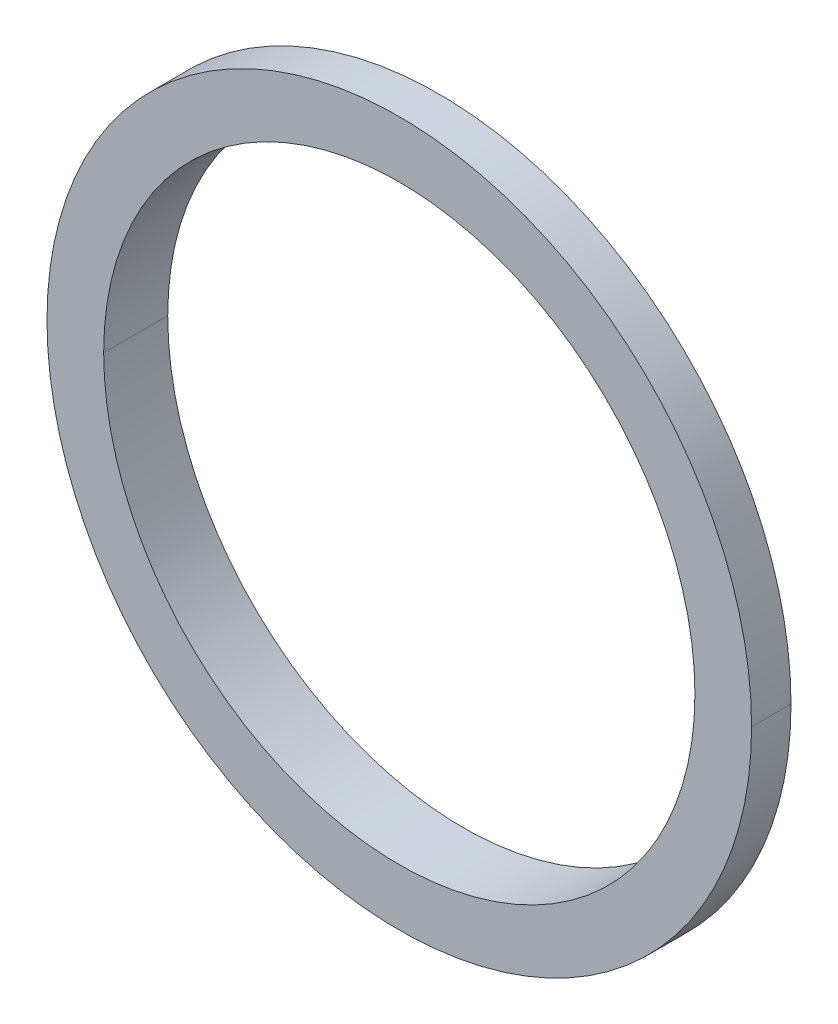
ISO-10303-21;
HEADER;
FILE_DESCRIPTION(('STEP AP214'),'2;1');
FILE_NAME('part.step','',(''),(''),'','','');
FILE_SCHEMA(('AUTOMOTIVE_DESIGN { 1 0 10303 214 1 1 1 1 }'));
ENDSEC;
DATA;
#1=APPLICATION_CONTEXT('core data for automotive mechanical design processes');
#2=APPLICATION_PROTOCOL_DEFINITION('international standard','automotive_design',2000,#1);
#3=PRODUCT_CONTEXT('',#1,'mechanical');
#4=PRODUCT('Part','Part','',(#3));
#5=PRODUCT_RELATED_PRODUCT_CATEGORY('part','',(#4));
#6=PRODUCT_DEFINITION_FORMATION('','',#4);
#7=PRODUCT_DEFINITION_CONTEXT('part definition',#1,'design');
#8=PRODUCT_DEFINITION('design','',#6,#7);
#9=PRODUCT_DEFINITION_SHAPE('','',#8);
#10=(LENGTH_UNIT() NAMED_UNIT(*) SI_UNIT(.MILLI.,.METRE.));
#11=(NAMED_UNIT(*) PLANE_ANGLE_UNIT() SI_UNIT($,.RADIAN.));
#12=(NAMED_UNIT(*) SI_UNIT($,.STERADIAN.) SOLID_ANGLE_UNIT());
#13=UNCERTAINTY_MEASURE_WITH_UNIT(LENGTH_MEASURE(1.E-05),#10,'distance_accuracy_value','');
#14=(GEOMETRIC_REPRESENTATION_CONTEXT(3) GLOBAL_UNCERTAINTY_ASSIGNED_CONTEXT((#13)) GLOBAL_UNIT_ASSIGNED_CONTEXT((#10,
#11,#12)) REPRESENTATION_CONTEXT('',''));
#15=CARTESIAN_POINT('',(0.,0.,0.));
#16=DIRECTION('',(0.,0.,1.));
#17=DIRECTION('',(1.,0.,0.));
#18=AXIS2_PLACEMENT_3D('',#15,#16,#17);
#19=CARTESIAN_POINT('',(0.,0.,0.));
#20=DIRECTION('',(0.,0.,1.));
#21=DIRECTION('',(1.,0.,0.));
#22=AXIS2_PLACEMENT_3D('',#19,#20,#21);
#23=PLANE('',#22);
#24=CARTESIAN_POINT('',(0.,0.,0.));
#25=DIRECTION('',(0.,0.,1.));
#26=DIRECTION('',(1.,0.,0.));
#27=AXIS2_PLACEMENT_3D('',#24,#25,#26);
#28=CIRCLE('',#27,12.);
#29=CARTESIAN_POINT('',(12.,0.,0.));
#30=VERTEX_POINT('',#29);
#31=CARTESIAN_POINT('',(-12.,0.,0.));
#32=VERTEX_POINT('',#31);
#33=EDGE_CURVE('E20',#30,#32,#28,.T.);
#34=ORIENTED_EDGE('',*,*,#33,.T.);
#35=CARTESIAN_POINT('',(0.,0.,0.));
#36=DIRECTION('',(0.,0.,1.));
#37=DIRECTION('',(1.,0.,0.));
#38=AXIS2_PLACEMENT_3D('',#35,#36,#37);
#39=CIRCLE('',#38,12.);
#40=EDGE_CURVE('E11',#32,#30,#39,.T.);
#41=ORIENTED_EDGE('',*,*,#40,.T.);
#42=EDGE_LOOP('',(#34,#41));
#43=FACE_BOUND('',#42,.T.);
#44=CARTESIAN_POINT('',(0.,0.,0.));
#45=DIRECTION('',(0.,0.,1.));
#46=DIRECTION('',(1.,0.,0.));
#47=AXIS2_PLACEMENT_3D('',#44,#45,#46);
#48=CIRCLE('',#47,12.5);
#49=CARTESIAN_POINT('',(-12.5,0.,0.));
#50=VERTEX_POINT('',#49);
#51=CARTESIAN_POINT('',(12.5,0.,0.));
#52=VERTEX_POINT('',#51);
#53=EDGE_CURVE('E69',#50,#52,#48,.T.);
#54=ORIENTED_EDGE('',*,*,#53,.F.);
#55=CARTESIAN_POINT('',(0.,0.,0.));
#56=DIRECTION('',(0.,0.,1.));
#57=DIRECTION('',(1.,0.,0.));
#58=AXIS2_PLACEMENT_3D('',#55,#56,#57);
#59=CIRCLE('',#58,12.5);
#60=EDGE_CURVE('E98',#52,#50,#59,.T.);
#61=ORIENTED_EDGE('',*,*,#60,.F.);
#62=EDGE_LOOP('',(#54,#61));
#63=FACE_BOUND('',#62,.T.);
#64=ADVANCED_FACE('F16',(#43,#63),#23,.F.);
#65=CARTESIAN_POINT('',(0.,0.,2.6));
#66=DIRECTION('',(0.,0.,1.));
#67=DIRECTION('',(1.,0.,0.));
#68=AXIS2_PLACEMENT_3D('',#65,#66,#67);
#69=PLANE('',#68);
#70=CARTESIAN_POINT('',(0.,0.,2.6));
#71=DIRECTION('',(0.,0.,1.));
#72=DIRECTION('',(1.,0.,0.));
#73=AXIS2_PLACEMENT_3D('',#70,#71,#72);
#74=CIRCLE('',#73,12.);
#75=CARTESIAN_POINT('',(-12.,0.,2.6));
#76=VERTEX_POINT('',#75);
#77=CARTESIAN_POINT('',(12.,0.,2.6));
#78=VERTEX_POINT('',#77);
#79=EDGE_CURVE('E27',#76,#78,#74,.T.);
#80=ORIENTED_EDGE('',*,*,#79,.F.);
#81=CARTESIAN_POINT('',(0.,0.,2.6));
#82=DIRECTION('',(0.,0.,1.));
#83=DIRECTION('',(1.,0.,0.));
#84=AXIS2_PLACEMENT_3D('',#81,#82,#83);
#85=CIRCLE('',#84,12.);
#86=EDGE_CURVE('E124',#78,#76,#85,.T.);
#87=ORIENTED_EDGE('',*,*,#86,.F.);
#88=EDGE_LOOP('',(#80,#87));
#89=FACE_BOUND('',#88,.T.);
#90=CARTESIAN_POINT('',(0.,0.,2.6));
#91=DIRECTION('',(0.,0.,1.));
#92=DIRECTION('',(1.,0.,0.));
#93=AXIS2_PLACEMENT_3D('',#90,#91,#92);
#94=CIRCLE('',#93,14.3);
#95=CARTESIAN_POINT('',(14.3,0.,2.6));
#96=VERTEX_POINT('',#95);
#97=CARTESIAN_POINT('',(-14.3,0.,2.6));
#98=VERTEX_POINT('',#97);
#99=EDGE_CURVE('E120',#96,#98,#94,.T.);
#100=ORIENTED_EDGE('',*,*,#99,.T.);
#101=CARTESIAN_POINT('',(0.,0.,2.6));
#102=DIRECTION('',(0.,0.,1.));
#103=DIRECTION('',(1.,0.,0.));
#104=AXIS2_PLACEMENT_3D('',#101,#102,#103);
#105=CIRCLE('',#104,14.3);
#106=EDGE_CURVE('E109',#98,#96,#105,.T.);
#107=ORIENTED_EDGE('',*,*,#106,.T.);
#108=EDGE_LOOP('',(#100,#107));
#109=FACE_BOUND('',#108,.T.);
#110=ADVANCED_FACE('F188',(#89,#109),#69,.T.);
#111=CARTESIAN_POINT('',(0.,0.,0.5));
#112=DIRECTION('',(0.,0.,1.));
#113=DIRECTION('',(1.,0.,0.));
#114=AXIS2_PLACEMENT_3D('',#111,#112,#113);
#115=CYLINDRICAL_SURFACE('',#114,12.);
#116=ORIENTED_EDGE('',*,*,#79,.T.);
#117=DIRECTION('',(0.,0.,1.));
#118=VECTOR('',#117,1.);
#119=CARTESIAN_POINT('',(12.,0.,1.3));
#120=LINE('',#119,#118);
#121=EDGE_CURVE('E123',#30,#78,#120,.T.);
#122=ORIENTED_EDGE('',*,*,#121,.F.);
#123=ORIENTED_EDGE('',*,*,#40,.F.);
#124=DIRECTION('',(0.,0.,1.));
#125=VECTOR('',#124,1.);
#126=CARTESIAN_POINT('',(-12.,0.,1.3));
#127=LINE('',#126,#125);
#128=EDGE_CURVE('E127',#32,#76,#127,.T.);
#129=ORIENTED_EDGE('',*,*,#128,.T.);
#130=EDGE_LOOP('',(#116,#122,#123,#129));
#131=FACE_BOUND('',#130,.T.);
#132=ADVANCED_FACE('F179',(#131),#115,.F.);
#133=CARTESIAN_POINT('',(0.,0.,0.5));
#134=DIRECTION('',(0.,0.,1.));
#135=DIRECTION('',(1.,0.,0.));
#136=AXIS2_PLACEMENT_3D('',#133,#134,#135);
#137=CYLINDRICAL_SURFACE('',#136,12.);
#138=ORIENTED_EDGE('',*,*,#86,.T.);
#139=ORIENTED_EDGE('',*,*,#128,.F.);
#140=ORIENTED_EDGE('',*,*,#33,.F.);
#141=ORIENTED_EDGE('',*,*,#121,.T.);
#142=EDGE_LOOP('',(#138,#139,#140,#141));
#143=FACE_BOUND('',#142,.T.);
#144=ADVANCED_FACE('F174',(#143),#137,.F.);
#145=CARTESIAN_POINT('',(0.,0.,0.5));
#146=DIRECTION('',(0.,0.,1.));
#147=DIRECTION('',(1.,0.,0.));
#148=AXIS2_PLACEMENT_3D('',#145,#146,#147);
#149=CYLINDRICAL_SURFACE('',#148,12.5);
#150=DIRECTION('',(0.,0.,1.));
#151=VECTOR('',#150,1.);
#152=CARTESIAN_POINT('',(-12.5,0.,0.5));
#153=LINE('',#152,#151);
#154=CARTESIAN_POINT('',(-12.5,0.,1.));
#155=VERTEX_POINT('',#154);
#156=EDGE_CURVE('E102',#50,#155,#153,.T.);
#157=ORIENTED_EDGE('',*,*,#156,.F.);
#158=ORIENTED_EDGE('',*,*,#53,.T.);
#159=DIRECTION('',(0.,0.,1.));
#160=VECTOR('',#159,1.);
#161=CARTESIAN_POINT('',(12.5,0.,0.5));
#162=LINE('',#161,#160);
#163=CARTESIAN_POINT('',(12.5,0.,1.));
#164=VERTEX_POINT('',#163);
#165=EDGE_CURVE('E90',#52,#164,#162,.T.);
#166=ORIENTED_EDGE('',*,*,#165,.T.);
#167=CARTESIAN_POINT('',(0.,0.,1.));
#168=DIRECTION('',(0.,0.,1.));
#169=DIRECTION('',(1.,0.,0.));
#170=AXIS2_PLACEMENT_3D('',#167,#168,#169);
#171=CIRCLE('',#170,12.5);
#172=EDGE_CURVE('E94',#155,#164,#171,.T.);
#173=ORIENTED_EDGE('',*,*,#172,.F.);
#174=EDGE_LOOP('',(#157,#158,#166,#173));
#175=FACE_BOUND('',#174,.T.);
#176=ADVANCED_FACE('F92',(#175),#149,.T.);
#177=CARTESIAN_POINT('',(0.,0.,0.5));
#178=DIRECTION('',(0.,0.,1.));
#179=DIRECTION('',(1.,0.,0.));
#180=AXIS2_PLACEMENT_3D('',#177,#178,#179);
#181=CYLINDRICAL_SURFACE('',#180,12.5);
#182=ORIENTED_EDGE('',*,*,#165,.F.);
#183=ORIENTED_EDGE('',*,*,#60,.T.);
#184=ORIENTED_EDGE('',*,*,#156,.T.);
#185=CARTESIAN_POINT('',(0.,0.,1.));
#186=DIRECTION('',(0.,0.,1.));
#187=DIRECTION('',(1.,0.,0.));
#188=AXIS2_PLACEMENT_3D('',#185,#186,#187);
#189=CIRCLE('',#188,12.5);
#190=EDGE_CURVE('E99',#164,#155,#189,.T.);
#191=ORIENTED_EDGE('',*,*,#190,.F.);
#192=EDGE_LOOP('',(#182,#183,#184,#191));
#193=FACE_BOUND('',#192,.T.);
#194=ADVANCED_FACE('F101',(#193),#181,.T.);
#195=CARTESIAN_POINT('',(0.,0.,1.));
#196=DIRECTION('',(0.,0.,1.));
#197=DIRECTION('',(1.,0.,0.));
#198=AXIS2_PLACEMENT_3D('',#195,#196,#197);
#199=PLANE('',#198);
#200=ORIENTED_EDGE('',*,*,#172,.T.);
#201=ORIENTED_EDGE('',*,*,#190,.T.);
#202=EDGE_LOOP('',(#200,#201));
#203=FACE_BOUND('',#202,.T.);
#204=CARTESIAN_POINT('',(0.,0.,1.));
#205=DIRECTION('',(0.,0.,1.));
#206=DIRECTION('',(1.,0.,0.));
#207=AXIS2_PLACEMENT_3D('',#204,#205,#206);
#208=CIRCLE('',#207,14.3);
#209=CARTESIAN_POINT('',(-14.3,0.,1.));
#210=VERTEX_POINT('',#209);
#211=CARTESIAN_POINT('',(14.3,0.,1.));
#212=VERTEX_POINT('',#211);
#213=EDGE_CURVE('E116',#210,#212,#208,.T.);
#214=ORIENTED_EDGE('',*,*,#213,.F.);
#215=CARTESIAN_POINT('',(0.,0.,1.));
#216=DIRECTION('',(0.,0.,1.));
#217=DIRECTION('',(1.,0.,0.));
#218=AXIS2_PLACEMENT_3D('',#215,#216,#217);
#219=CIRCLE('',#218,14.3);
#220=EDGE_CURVE('E135',#212,#210,#219,.T.);
#221=ORIENTED_EDGE('',*,*,#220,.F.);
#222=EDGE_LOOP('',(#214,#221));
#223=FACE_BOUND('',#222,.T.);
#224=ADVANCED_FACE('F106',(#203,#223),#199,.F.);
#225=CARTESIAN_POINT('',(0.,0.,1.8));
#226=DIRECTION('',(0.,0.,1.));
#227=DIRECTION('',(1.,0.,0.));
#228=AXIS2_PLACEMENT_3D('',#225,#226,#227);
#229=CYLINDRICAL_SURFACE('',#228,14.3);
#230=DIRECTION('',(0.,0.,1.));
#231=VECTOR('',#230,1.);
#232=CARTESIAN_POINT('',(-14.3,0.,1.8));
#233=LINE('',#232,#231);
#234=EDGE_CURVE('E131',#210,#98,#233,.T.);
#235=ORIENTED_EDGE('',*,*,#234,.F.);
#236=ORIENTED_EDGE('',*,*,#213,.T.);
#237=DIRECTION('',(0.,0.,1.));
#238=VECTOR('',#237,1.);
#239=CARTESIAN_POINT('',(14.3,0.,1.8));
#240=LINE('',#239,#238);
#241=EDGE_CURVE('E307',#212,#96,#240,.T.);
#242=ORIENTED_EDGE('',*,*,#241,.T.);
#243=ORIENTED_EDGE('',*,*,#106,.F.);
#244=EDGE_LOOP('',(#235,#236,#242,#243));
#245=FACE_BOUND('',#244,.T.);
#246=ADVANCED_FACE('F18',(#245),#229,.T.);
#247=CARTESIAN_POINT('',(0.,0.,1.8));
#248=DIRECTION('',(0.,0.,1.));
#249=DIRECTION('',(1.,0.,0.));
#250=AXIS2_PLACEMENT_3D('',#247,#248,#249);
#251=CYLINDRICAL_SURFACE('',#250,14.3);
#252=ORIENTED_EDGE('',*,*,#241,.F.);
#253=ORIENTED_EDGE('',*,*,#220,.T.);
#254=ORIENTED_EDGE('',*,*,#234,.T.);
#255=ORIENTED_EDGE('',*,*,#99,.F.);
#256=EDGE_LOOP('',(#252,#253,#254,#255));
#257=FACE_BOUND('',#256,.T.);
#258=ADVANCED_FACE('F219',(#257),#251,.T.);
#259=CLOSED_SHELL('',(#64,#110,#132,#144,#176,#194,#224,#246,#258));
#260=MANIFOLD_SOLID_BREP('B1',#259);
#261=ADVANCED_BREP_SHAPE_REPRESENTATION('',(#18,#260),#14);
#262=SHAPE_DEFINITION_REPRESENTATION(#9,#261);
ENDSEC;
END-ISO-10303-21;
